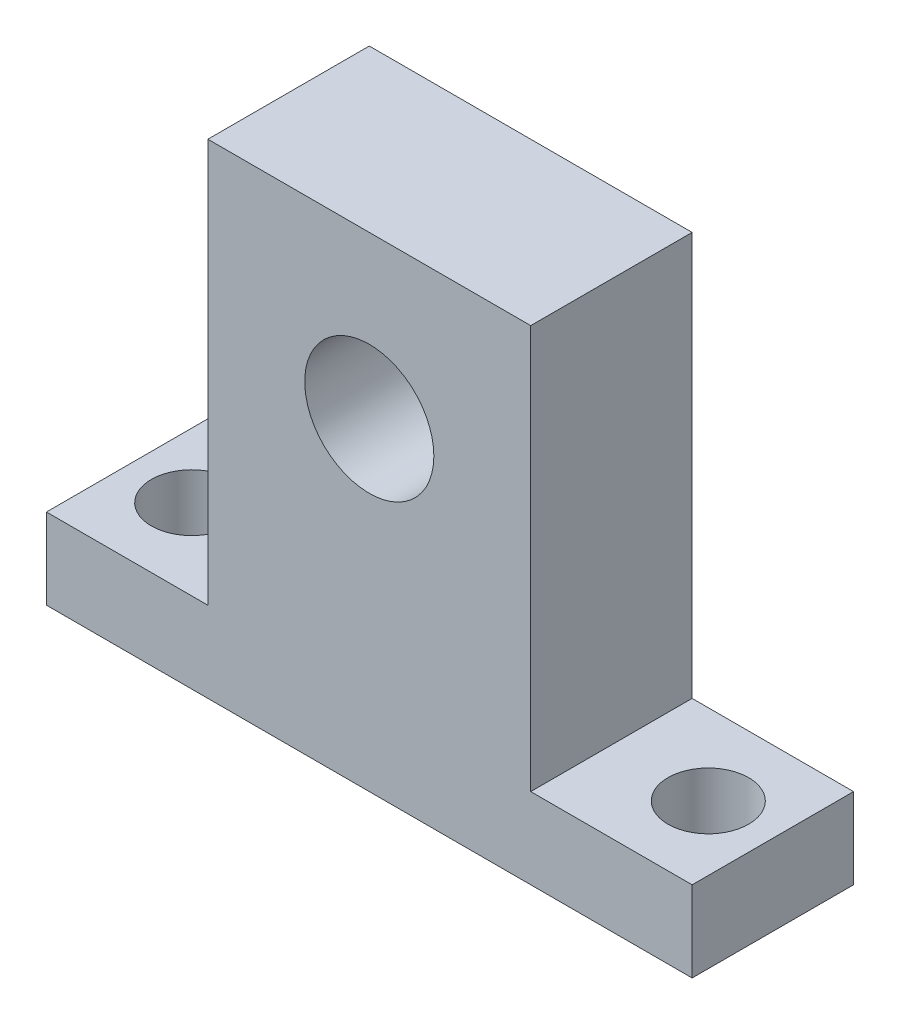
ISO-10303-21;
HEADER;
FILE_DESCRIPTION(('STEP AP214'),'2;1');
FILE_NAME('part.step','',(''),(''),'','','');
FILE_SCHEMA(('AUTOMOTIVE_DESIGN { 1 0 10303 214 1 1 1 1 }'));
ENDSEC;
DATA;
#1=APPLICATION_CONTEXT('core data for automotive mechanical design processes');
#2=APPLICATION_PROTOCOL_DEFINITION('international standard','automotive_design',2000,#1);
#3=PRODUCT_CONTEXT('',#1,'mechanical');
#4=PRODUCT('Part','Part','',(#3));
#5=PRODUCT_RELATED_PRODUCT_CATEGORY('part','',(#4));
#6=PRODUCT_DEFINITION_FORMATION('','',#4);
#7=PRODUCT_DEFINITION_CONTEXT('part definition',#1,'design');
#8=PRODUCT_DEFINITION('design','',#6,#7);
#9=PRODUCT_DEFINITION_SHAPE('','',#8);
#10=(LENGTH_UNIT() NAMED_UNIT(*) SI_UNIT(.MILLI.,.METRE.));
#11=(NAMED_UNIT(*) PLANE_ANGLE_UNIT() SI_UNIT($,.RADIAN.));
#12=(NAMED_UNIT(*) SI_UNIT($,.STERADIAN.) SOLID_ANGLE_UNIT());
#13=UNCERTAINTY_MEASURE_WITH_UNIT(LENGTH_MEASURE(1.E-05),#10,'distance_accuracy_value','');
#14=(GEOMETRIC_REPRESENTATION_CONTEXT(3) GLOBAL_UNCERTAINTY_ASSIGNED_CONTEXT((#13)) GLOBAL_UNIT_ASSIGNED_CONTEXT((#10,
#11,#12)) REPRESENTATION_CONTEXT('',''));
#15=CARTESIAN_POINT('',(0.,0.,0.));
#16=DIRECTION('',(0.,0.,1.));
#17=DIRECTION('',(1.,0.,0.));
#18=AXIS2_PLACEMENT_3D('',#15,#16,#17);
#19=CARTESIAN_POINT('',(10.,10.,-5.));
#20=DIRECTION('',(0.,1.,0.));
#21=DIRECTION('',(0.,0.,1.));
#22=AXIS2_PLACEMENT_3D('',#19,#20,#21);
#23=PLANE('',#22);
#24=DIRECTION('',(0.,0.,1.));
#25=VECTOR('',#24,1.);
#26=CARTESIAN_POINT('',(-10.,10.,-5.));
#27=LINE('',#26,#25);
#28=CARTESIAN_POINT('',(-10.,10.,-5.));
#29=VERTEX_POINT('',#28);
#30=CARTESIAN_POINT('',(-10.,10.,5.));
#31=VERTEX_POINT('',#30);
#32=EDGE_CURVE('E95',#29,#31,#27,.T.);
#33=ORIENTED_EDGE('',*,*,#32,.T.);
#34=DIRECTION('',(-1.,0.,0.));
#35=VECTOR('',#34,1.);
#36=CARTESIAN_POINT('',(10.,10.,5.));
#37=LINE('',#36,#35);
#38=CARTESIAN_POINT('',(10.,10.,5.));
#39=VERTEX_POINT('',#38);
#40=EDGE_CURVE('E98',#39,#31,#37,.T.);
#41=ORIENTED_EDGE('',*,*,#40,.F.);
#42=DIRECTION('',(0.,0.,1.));
#43=VECTOR('',#42,1.);
#44=CARTESIAN_POINT('',(10.,10.,-5.));
#45=LINE('',#44,#43);
#46=CARTESIAN_POINT('',(10.,10.,-5.));
#47=VERTEX_POINT('',#46);
#48=EDGE_CURVE('E11',#47,#39,#45,.T.);
#49=ORIENTED_EDGE('',*,*,#48,.F.);
#50=DIRECTION('',(-1.,0.,0.));
#51=VECTOR('',#50,1.);
#52=CARTESIAN_POINT('',(10.,10.,-5.));
#53=LINE('',#52,#51);
#54=EDGE_CURVE('E99',#47,#29,#53,.T.);
#55=ORIENTED_EDGE('',*,*,#54,.T.);
#56=EDGE_LOOP('',(#33,#41,#49,#55));
#57=FACE_BOUND('',#56,.T.);
#58=ADVANCED_FACE('F33',(#57),#23,.T.);
#59=CARTESIAN_POINT('',(10.,-15.,-5.));
#60=DIRECTION('',(1.,0.,0.));
#61=DIRECTION('',(0.,0.,-1.));
#62=AXIS2_PLACEMENT_3D('',#59,#60,#61);
#63=PLANE('',#62);
#64=ORIENTED_EDGE('',*,*,#48,.T.);
#65=DIRECTION('',(0.,1.,0.));
#66=VECTOR('',#65,1.);
#67=CARTESIAN_POINT('',(10.,-15.,5.));
#68=LINE('',#67,#66);
#69=CARTESIAN_POINT('',(10.,-15.,5.));
#70=VERTEX_POINT('',#69);
#71=EDGE_CURVE('E116',#70,#39,#68,.T.);
#72=ORIENTED_EDGE('',*,*,#71,.F.);
#73=DIRECTION('',(0.,0.,1.));
#74=VECTOR('',#73,1.);
#75=CARTESIAN_POINT('',(10.,-15.,-5.));
#76=LINE('',#75,#74);
#77=CARTESIAN_POINT('',(10.,-15.,-5.));
#78=VERTEX_POINT('',#77);
#79=EDGE_CURVE('E41',#78,#70,#76,.T.);
#80=ORIENTED_EDGE('',*,*,#79,.F.);
#81=DIRECTION('',(0.,1.,0.));
#82=VECTOR('',#81,1.);
#83=CARTESIAN_POINT('',(10.,-15.,-5.));
#84=LINE('',#83,#82);
#85=EDGE_CURVE('E104',#78,#47,#84,.T.);
#86=ORIENTED_EDGE('',*,*,#85,.T.);
#87=EDGE_LOOP('',(#64,#72,#80,#86));
#88=FACE_BOUND('',#87,.T.);
#89=ADVANCED_FACE('F186',(#88),#63,.T.);
#90=CARTESIAN_POINT('',(20.,-15.,-5.));
#91=DIRECTION('',(0.,1.,0.));
#92=DIRECTION('',(0.,0.,1.));
#93=AXIS2_PLACEMENT_3D('',#90,#91,#92);
#94=PLANE('',#93);
#95=CARTESIAN_POINT('',(16.,-15.,0.));
#96=DIRECTION('',(0.,1.,0.));
#97=DIRECTION('',(0.,0.,1.));
#98=AXIS2_PLACEMENT_3D('',#95,#96,#97);
#99=CIRCLE('',#98,2.5);
#100=CARTESIAN_POINT('',(16.,-15.,2.5));
#101=VERTEX_POINT('',#100);
#102=EDGE_CURVE('E220',#101,#101,#99,.T.);
#103=ORIENTED_EDGE('',*,*,#102,.F.);
#104=EDGE_LOOP('',(#103));
#105=FACE_BOUND('',#104,.T.);
#106=ORIENTED_EDGE('',*,*,#79,.T.);
#107=DIRECTION('',(-1.,0.,0.));
#108=VECTOR('',#107,1.);
#109=CARTESIAN_POINT('',(20.,-15.,5.));
#110=LINE('',#109,#108);
#111=CARTESIAN_POINT('',(20.,-15.,5.));
#112=VERTEX_POINT('',#111);
#113=EDGE_CURVE('E134',#112,#70,#110,.T.);
#114=ORIENTED_EDGE('',*,*,#113,.F.);
#115=DIRECTION('',(0.,0.,1.));
#116=VECTOR('',#115,1.);
#117=CARTESIAN_POINT('',(20.,-15.,-5.));
#118=LINE('',#117,#116);
#119=CARTESIAN_POINT('',(20.,-15.,-5.));
#120=VERTEX_POINT('',#119);
#121=EDGE_CURVE('E156',#120,#112,#118,.T.);
#122=ORIENTED_EDGE('',*,*,#121,.F.);
#123=DIRECTION('',(-1.,0.,0.));
#124=VECTOR('',#123,1.);
#125=CARTESIAN_POINT('',(20.,-15.,-5.));
#126=LINE('',#125,#124);
#127=EDGE_CURVE('E152',#120,#78,#126,.T.);
#128=ORIENTED_EDGE('',*,*,#127,.T.);
#129=EDGE_LOOP('',(#106,#114,#122,#128));
#130=FACE_BOUND('',#129,.T.);
#131=ADVANCED_FACE('F185',(#105,#130),#94,.T.);
#132=CARTESIAN_POINT('',(20.,-20.,-5.));
#133=DIRECTION('',(1.,0.,0.));
#134=DIRECTION('',(0.,1.,0.));
#135=AXIS2_PLACEMENT_3D('',#132,#133,#134);
#136=PLANE('',#135);
#137=ORIENTED_EDGE('',*,*,#121,.T.);
#138=DIRECTION('',(0.,1.,0.));
#139=VECTOR('',#138,1.);
#140=CARTESIAN_POINT('',(20.,-20.,5.));
#141=LINE('',#140,#139);
#142=CARTESIAN_POINT('',(20.,-20.,5.));
#143=VERTEX_POINT('',#142);
#144=EDGE_CURVE('E131',#143,#112,#141,.T.);
#145=ORIENTED_EDGE('',*,*,#144,.F.);
#146=DIRECTION('',(0.,0.,1.));
#147=VECTOR('',#146,1.);
#148=CARTESIAN_POINT('',(20.,-20.,-5.));
#149=LINE('',#148,#147);
#150=CARTESIAN_POINT('',(20.,-20.,-5.));
#151=VERTEX_POINT('',#150);
#152=EDGE_CURVE('E158',#151,#143,#149,.T.);
#153=ORIENTED_EDGE('',*,*,#152,.F.);
#154=DIRECTION('',(0.,1.,0.));
#155=VECTOR('',#154,1.);
#156=CARTESIAN_POINT('',(20.,-20.,-5.));
#157=LINE('',#156,#155);
#158=EDGE_CURVE('E149',#151,#120,#157,.T.);
#159=ORIENTED_EDGE('',*,*,#158,.T.);
#160=EDGE_LOOP('',(#137,#145,#153,#159));
#161=FACE_BOUND('',#160,.T.);
#162=ADVANCED_FACE('F181',(#161),#136,.T.);
#163=CARTESIAN_POINT('',(-20.,-20.,-5.));
#164=DIRECTION('',(0.,-1.,0.));
#165=DIRECTION('',(0.,0.,-1.));
#166=AXIS2_PLACEMENT_3D('',#163,#164,#165);
#167=PLANE('',#166);
#168=CARTESIAN_POINT('',(-16.,-20.,0.));
#169=DIRECTION('',(0.,1.,0.));
#170=DIRECTION('',(0.,0.,1.));
#171=AXIS2_PLACEMENT_3D('',#168,#169,#170);
#172=CIRCLE('',#171,2.5);
#173=CARTESIAN_POINT('',(-16.,-20.,2.5));
#174=VERTEX_POINT('',#173);
#175=EDGE_CURVE('E227',#174,#174,#172,.T.);
#176=ORIENTED_EDGE('',*,*,#175,.T.);
#177=EDGE_LOOP('',(#176));
#178=FACE_BOUND('',#177,.T.);
#179=CARTESIAN_POINT('',(16.,-20.,0.));
#180=DIRECTION('',(0.,1.,0.));
#181=DIRECTION('',(0.,0.,1.));
#182=AXIS2_PLACEMENT_3D('',#179,#180,#181);
#183=CIRCLE('',#182,2.5);
#184=CARTESIAN_POINT('',(16.,-20.,2.5));
#185=VERTEX_POINT('',#184);
#186=EDGE_CURVE('E224',#185,#185,#183,.T.);
#187=ORIENTED_EDGE('',*,*,#186,.T.);
#188=EDGE_LOOP('',(#187));
#189=FACE_BOUND('',#188,.T.);
#190=ORIENTED_EDGE('',*,*,#152,.T.);
#191=DIRECTION('',(1.,0.,0.));
#192=VECTOR('',#191,1.);
#193=CARTESIAN_POINT('',(-20.,-20.,5.));
#194=LINE('',#193,#192);
#195=CARTESIAN_POINT('',(-20.,-20.,5.));
#196=VERTEX_POINT('',#195);
#197=EDGE_CURVE('E128',#196,#143,#194,.T.);
#198=ORIENTED_EDGE('',*,*,#197,.F.);
#199=DIRECTION('',(0.,0.,1.));
#200=VECTOR('',#199,1.);
#201=CARTESIAN_POINT('',(-20.,-20.,-5.));
#202=LINE('',#201,#200);
#203=CARTESIAN_POINT('',(-20.,-20.,-5.));
#204=VERTEX_POINT('',#203);
#205=EDGE_CURVE('E160',#204,#196,#202,.T.);
#206=ORIENTED_EDGE('',*,*,#205,.F.);
#207=DIRECTION('',(1.,0.,0.));
#208=VECTOR('',#207,1.);
#209=CARTESIAN_POINT('',(-20.,-20.,-5.));
#210=LINE('',#209,#208);
#211=EDGE_CURVE('E146',#204,#151,#210,.T.);
#212=ORIENTED_EDGE('',*,*,#211,.T.);
#213=EDGE_LOOP('',(#190,#198,#206,#212));
#214=FACE_BOUND('',#213,.T.);
#215=ADVANCED_FACE('F174',(#178,#189,#214),#167,.T.);
#216=CARTESIAN_POINT('',(-20.,-15.,-5.));
#217=DIRECTION('',(-1.,0.,0.));
#218=DIRECTION('',(0.,0.,1.));
#219=AXIS2_PLACEMENT_3D('',#216,#217,#218);
#220=PLANE('',#219);
#221=ORIENTED_EDGE('',*,*,#205,.T.);
#222=DIRECTION('',(0.,-1.,0.));
#223=VECTOR('',#222,1.);
#224=CARTESIAN_POINT('',(-20.,-15.,5.));
#225=LINE('',#224,#223);
#226=CARTESIAN_POINT('',(-20.,-15.,5.));
#227=VERTEX_POINT('',#226);
#228=EDGE_CURVE('E125',#227,#196,#225,.T.);
#229=ORIENTED_EDGE('',*,*,#228,.F.);
#230=DIRECTION('',(0.,0.,1.));
#231=VECTOR('',#230,1.);
#232=CARTESIAN_POINT('',(-20.,-15.,-5.));
#233=LINE('',#232,#231);
#234=CARTESIAN_POINT('',(-20.,-15.,-5.));
#235=VERTEX_POINT('',#234);
#236=EDGE_CURVE('E162',#235,#227,#233,.T.);
#237=ORIENTED_EDGE('',*,*,#236,.F.);
#238=DIRECTION('',(0.,-1.,0.));
#239=VECTOR('',#238,1.);
#240=CARTESIAN_POINT('',(-20.,-15.,-5.));
#241=LINE('',#240,#239);
#242=EDGE_CURVE('E143',#235,#204,#241,.T.);
#243=ORIENTED_EDGE('',*,*,#242,.T.);
#244=EDGE_LOOP('',(#221,#229,#237,#243));
#245=FACE_BOUND('',#244,.T.);
#246=ADVANCED_FACE('F171',(#245),#220,.T.);
#247=CARTESIAN_POINT('',(-10.,-15.,-5.));
#248=DIRECTION('',(0.,1.,0.));
#249=DIRECTION('',(0.,0.,1.));
#250=AXIS2_PLACEMENT_3D('',#247,#248,#249);
#251=PLANE('',#250);
#252=CARTESIAN_POINT('',(-16.,-15.,0.));
#253=DIRECTION('',(0.,1.,0.));
#254=DIRECTION('',(0.,0.,1.));
#255=AXIS2_PLACEMENT_3D('',#252,#253,#254);
#256=CIRCLE('',#255,2.5);
#257=CARTESIAN_POINT('',(-16.,-15.,2.5));
#258=VERTEX_POINT('',#257);
#259=EDGE_CURVE('E36',#258,#258,#256,.T.);
#260=ORIENTED_EDGE('',*,*,#259,.F.);
#261=EDGE_LOOP('',(#260));
#262=FACE_BOUND('',#261,.T.);
#263=ORIENTED_EDGE('',*,*,#236,.T.);
#264=DIRECTION('',(-1.,0.,0.));
#265=VECTOR('',#264,1.);
#266=CARTESIAN_POINT('',(-10.,-15.,5.));
#267=LINE('',#266,#265);
#268=CARTESIAN_POINT('',(-10.,-15.,5.));
#269=VERTEX_POINT('',#268);
#270=EDGE_CURVE('E111',#269,#227,#267,.T.);
#271=ORIENTED_EDGE('',*,*,#270,.F.);
#272=DIRECTION('',(0.,0.,1.));
#273=VECTOR('',#272,1.);
#274=CARTESIAN_POINT('',(-10.,-15.,-5.));
#275=LINE('',#274,#273);
#276=CARTESIAN_POINT('',(-10.,-15.,-5.));
#277=VERTEX_POINT('',#276);
#278=EDGE_CURVE('E103',#277,#269,#275,.T.);
#279=ORIENTED_EDGE('',*,*,#278,.F.);
#280=DIRECTION('',(-1.,0.,0.));
#281=VECTOR('',#280,1.);
#282=CARTESIAN_POINT('',(-10.,-15.,-5.));
#283=LINE('',#282,#281);
#284=EDGE_CURVE('E140',#277,#235,#283,.T.);
#285=ORIENTED_EDGE('',*,*,#284,.T.);
#286=EDGE_LOOP('',(#263,#271,#279,#285));
#287=FACE_BOUND('',#286,.T.);
#288=ADVANCED_FACE('F165',(#262,#287),#251,.T.);
#289=CARTESIAN_POINT('',(-10.,10.,-5.));
#290=DIRECTION('',(-1.,0.,0.));
#291=DIRECTION('',(0.,0.,1.));
#292=AXIS2_PLACEMENT_3D('',#289,#290,#291);
#293=PLANE('',#292);
#294=ORIENTED_EDGE('',*,*,#278,.T.);
#295=DIRECTION('',(0.,-1.,0.));
#296=VECTOR('',#295,1.);
#297=CARTESIAN_POINT('',(-10.,10.,5.));
#298=LINE('',#297,#296);
#299=EDGE_CURVE('E106',#31,#269,#298,.T.);
#300=ORIENTED_EDGE('',*,*,#299,.F.);
#301=ORIENTED_EDGE('',*,*,#32,.F.);
#302=DIRECTION('',(0.,-1.,0.));
#303=VECTOR('',#302,1.);
#304=CARTESIAN_POINT('',(-10.,10.,-5.));
#305=LINE('',#304,#303);
#306=EDGE_CURVE('E138',#29,#277,#305,.T.);
#307=ORIENTED_EDGE('',*,*,#306,.T.);
#308=EDGE_LOOP('',(#294,#300,#301,#307));
#309=FACE_BOUND('',#308,.T.);
#310=ADVANCED_FACE('F107',(#309),#293,.T.);
#311=CARTESIAN_POINT('',(0.,0.,-5.));
#312=DIRECTION('',(0.,0.,1.));
#313=DIRECTION('',(1.,0.,0.));
#314=AXIS2_PLACEMENT_3D('',#311,#312,#313);
#315=PLANE('',#314);
#316=CARTESIAN_POINT('',(0.,0.,-5.));
#317=DIRECTION('',(0.,0.,1.));
#318=DIRECTION('',(1.,0.,0.));
#319=AXIS2_PLACEMENT_3D('',#316,#317,#318);
#320=CIRCLE('',#319,4.);
#321=CARTESIAN_POINT('',(4.,0.,-5.));
#322=VERTEX_POINT('',#321);
#323=EDGE_CURVE('E120',#322,#322,#320,.T.);
#324=ORIENTED_EDGE('',*,*,#323,.T.);
#325=EDGE_LOOP('',(#324));
#326=FACE_BOUND('',#325,.T.);
#327=ORIENTED_EDGE('',*,*,#54,.F.);
#328=ORIENTED_EDGE('',*,*,#85,.F.);
#329=ORIENTED_EDGE('',*,*,#127,.F.);
#330=ORIENTED_EDGE('',*,*,#158,.F.);
#331=ORIENTED_EDGE('',*,*,#211,.F.);
#332=ORIENTED_EDGE('',*,*,#242,.F.);
#333=ORIENTED_EDGE('',*,*,#284,.F.);
#334=ORIENTED_EDGE('',*,*,#306,.F.);
#335=EDGE_LOOP('',(#327,#328,#329,#330,#331,#332,#333,#334));
#336=FACE_BOUND('',#335,.T.);
#337=ADVANCED_FACE('F177',(#326,#336),#315,.F.);
#338=CARTESIAN_POINT('',(0.,0.,5.));
#339=DIRECTION('',(0.,0.,1.));
#340=DIRECTION('',(1.,0.,0.));
#341=AXIS2_PLACEMENT_3D('',#338,#339,#340);
#342=PLANE('',#341);
#343=CARTESIAN_POINT('',(0.,0.,5.));
#344=DIRECTION('',(0.,0.,1.));
#345=DIRECTION('',(1.,0.,0.));
#346=AXIS2_PLACEMENT_3D('',#343,#344,#345);
#347=CIRCLE('',#346,4.);
#348=CARTESIAN_POINT('',(4.,0.,5.));
#349=VERTEX_POINT('',#348);
#350=EDGE_CURVE('E117',#349,#349,#347,.T.);
#351=ORIENTED_EDGE('',*,*,#350,.F.);
#352=EDGE_LOOP('',(#351));
#353=FACE_BOUND('',#352,.T.);
#354=ORIENTED_EDGE('',*,*,#40,.T.);
#355=ORIENTED_EDGE('',*,*,#299,.T.);
#356=ORIENTED_EDGE('',*,*,#270,.T.);
#357=ORIENTED_EDGE('',*,*,#228,.T.);
#358=ORIENTED_EDGE('',*,*,#197,.T.);
#359=ORIENTED_EDGE('',*,*,#144,.T.);
#360=ORIENTED_EDGE('',*,*,#113,.T.);
#361=ORIENTED_EDGE('',*,*,#71,.T.);
#362=EDGE_LOOP('',(#354,#355,#356,#357,#358,#359,#360,#361));
#363=FACE_BOUND('',#362,.T.);
#364=ADVANCED_FACE('F114',(#353,#363),#342,.T.);
#365=CARTESIAN_POINT('',(0.,0.,5.));
#366=DIRECTION('',(0.,0.,-1.));
#367=DIRECTION('',(-1.,0.,0.));
#368=AXIS2_PLACEMENT_3D('',#365,#366,#367);
#369=CYLINDRICAL_SURFACE('',#368,4.);
#370=ORIENTED_EDGE('',*,*,#350,.T.);
#371=EDGE_LOOP('',(#370));
#372=FACE_BOUND('',#371,.T.);
#373=ORIENTED_EDGE('',*,*,#323,.F.);
#374=EDGE_LOOP('',(#373));
#375=FACE_BOUND('',#374,.T.);
#376=ADVANCED_FACE('F215',(#372,#375),#369,.F.);
#377=CARTESIAN_POINT('',(-16.,-20.,0.));
#378=DIRECTION('',(0.,1.,0.));
#379=DIRECTION('',(0.,0.,1.));
#380=AXIS2_PLACEMENT_3D('',#377,#378,#379);
#381=CYLINDRICAL_SURFACE('',#380,2.5);
#382=ORIENTED_EDGE('',*,*,#259,.T.);
#383=EDGE_LOOP('',(#382));
#384=FACE_BOUND('',#383,.T.);
#385=ORIENTED_EDGE('',*,*,#175,.F.);
#386=EDGE_LOOP('',(#385));
#387=FACE_BOUND('',#386,.T.);
#388=ADVANCED_FACE('F233',(#384,#387),#381,.F.);
#389=CARTESIAN_POINT('',(16.,-20.,0.));
#390=DIRECTION('',(0.,1.,0.));
#391=DIRECTION('',(0.,0.,1.));
#392=AXIS2_PLACEMENT_3D('',#389,#390,#391);
#393=CYLINDRICAL_SURFACE('',#392,2.5);
#394=ORIENTED_EDGE('',*,*,#102,.T.);
#395=EDGE_LOOP('',(#394));
#396=FACE_BOUND('',#395,.T.);
#397=ORIENTED_EDGE('',*,*,#186,.F.);
#398=EDGE_LOOP('',(#397));
#399=FACE_BOUND('',#398,.T.);
#400=ADVANCED_FACE('F236',(#396,#399),#393,.F.);
#401=CLOSED_SHELL('',(#58,#89,#131,#162,#215,#246,#288,#310,#337,#364,#376,#388,#400));
#402=MANIFOLD_SOLID_BREP('B2',#401);
#403=ADVANCED_BREP_SHAPE_REPRESENTATION('',(#18,#402),#14);
#404=SHAPE_DEFINITION_REPRESENTATION(#9,#403);
ENDSEC;
END-ISO-10303-21;
